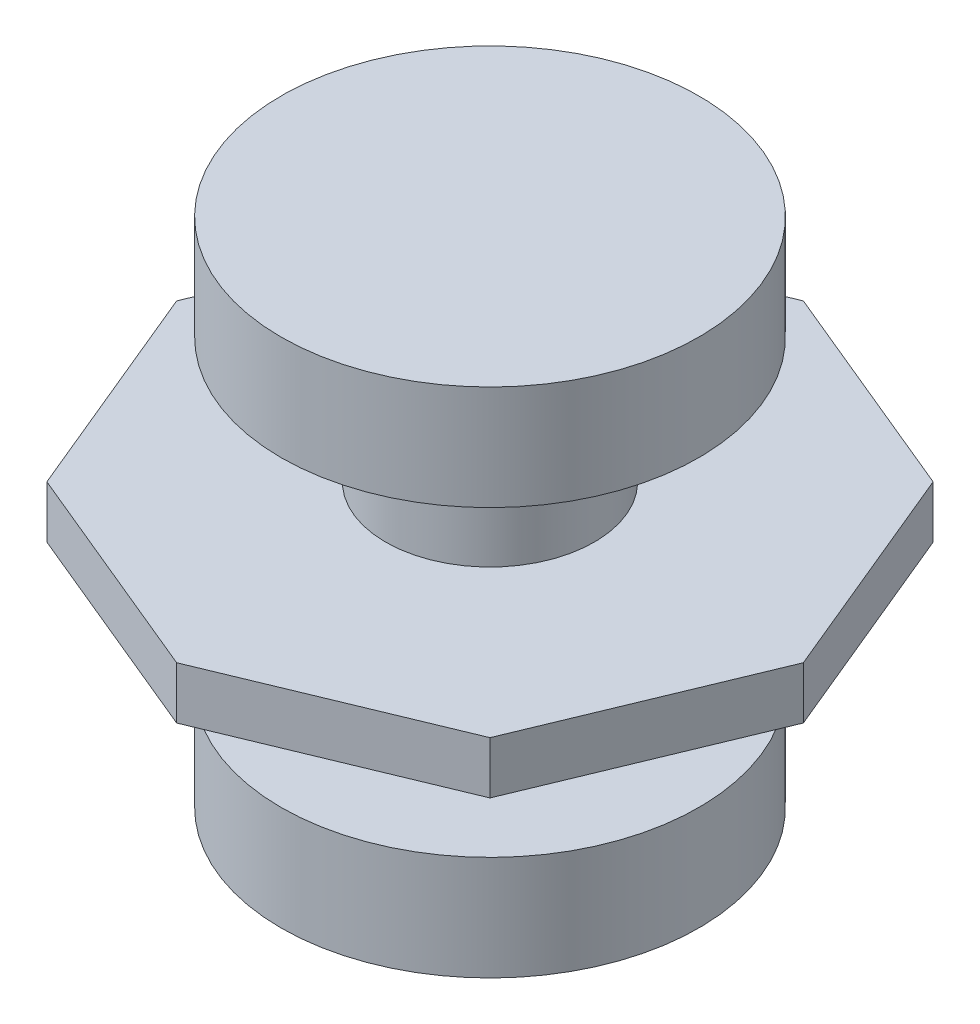
ISO-10303-21;
HEADER;
FILE_DESCRIPTION(('STEP AP214'),'2;1');
FILE_NAME('part.step','',(''),(''),'','','');
FILE_SCHEMA(('AUTOMOTIVE_DESIGN { 1 0 10303 214 1 1 1 1 }'));
ENDSEC;
DATA;
#1=APPLICATION_CONTEXT('core data for automotive mechanical design processes');
#2=APPLICATION_PROTOCOL_DEFINITION('international standard','automotive_design',2000,#1);
#3=PRODUCT_CONTEXT('',#1,'mechanical');
#4=PRODUCT('Part','Part','',(#3));
#5=PRODUCT_RELATED_PRODUCT_CATEGORY('part','',(#4));
#6=PRODUCT_DEFINITION_FORMATION('','',#4);
#7=PRODUCT_DEFINITION_CONTEXT('part definition',#1,'design');
#8=PRODUCT_DEFINITION('design','',#6,#7);
#9=PRODUCT_DEFINITION_SHAPE('','',#8);
#10=(LENGTH_UNIT() NAMED_UNIT(*) SI_UNIT(.MILLI.,.METRE.));
#11=(NAMED_UNIT(*) PLANE_ANGLE_UNIT() SI_UNIT($,.RADIAN.));
#12=(NAMED_UNIT(*) SI_UNIT($,.STERADIAN.) SOLID_ANGLE_UNIT());
#13=UNCERTAINTY_MEASURE_WITH_UNIT(LENGTH_MEASURE(1.E-05),#10,'distance_accuracy_value','');
#14=(GEOMETRIC_REPRESENTATION_CONTEXT(3) GLOBAL_UNCERTAINTY_ASSIGNED_CONTEXT((#13)) GLOBAL_UNIT_ASSIGNED_CONTEXT((#10,
#11,#12)) REPRESENTATION_CONTEXT('',''));
#15=CARTESIAN_POINT('',(0.,0.,0.));
#16=DIRECTION('',(0.,0.,1.));
#17=DIRECTION('',(1.,0.,0.));
#18=AXIS2_PLACEMENT_3D('',#15,#16,#17);
#19=CARTESIAN_POINT('',(0.,10.,0.));
#20=DIRECTION('',(0.,-1.,0.));
#21=DIRECTION('',(0.,0.,-1.));
#22=AXIS2_PLACEMENT_3D('',#19,#20,#21);
#23=CYLINDRICAL_SURFACE('',#22,20.);
#24=CARTESIAN_POINT('',(0.,10.,0.));
#25=DIRECTION('',(0.,1.,0.));
#26=DIRECTION('',(0.,0.,1.));
#27=AXIS2_PLACEMENT_3D('',#24,#25,#26);
#28=CIRCLE('',#27,20.);
#29=CARTESIAN_POINT('',(0.,10.,20.));
#30=VERTEX_POINT('',#29);
#31=EDGE_CURVE('E11',#30,#30,#28,.T.);
#32=ORIENTED_EDGE('',*,*,#31,.F.);
#33=EDGE_LOOP('',(#32));
#34=FACE_BOUND('',#33,.T.);
#35=CARTESIAN_POINT('',(0.,0.,0.));
#36=DIRECTION('',(0.,1.,0.));
#37=DIRECTION('',(0.,0.,1.));
#38=AXIS2_PLACEMENT_3D('',#35,#36,#37);
#39=CIRCLE('',#38,20.);
#40=CARTESIAN_POINT('',(0.,0.,20.));
#41=VERTEX_POINT('',#40);
#42=EDGE_CURVE('E36',#41,#41,#39,.T.);
#43=ORIENTED_EDGE('',*,*,#42,.T.);
#44=EDGE_LOOP('',(#43));
#45=FACE_BOUND('',#44,.T.);
#46=ADVANCED_FACE('F33',(#34,#45),#23,.T.);
#47=CARTESIAN_POINT('',(0.,10.,0.));
#48=DIRECTION('',(0.,1.,0.));
#49=DIRECTION('',(0.,0.,1.));
#50=AXIS2_PLACEMENT_3D('',#47,#48,#49);
#51=PLANE('',#50);
#52=CARTESIAN_POINT('',(0.,10.,0.));
#53=DIRECTION('',(0.,1.,0.));
#54=DIRECTION('',(0.,0.,1.));
#55=AXIS2_PLACEMENT_3D('',#52,#53,#54);
#56=CIRCLE('',#55,10.);
#57=CARTESIAN_POINT('',(0.,10.,10.));
#58=VERTEX_POINT('',#57);
#59=EDGE_CURVE('E160',#58,#58,#56,.T.);
#60=ORIENTED_EDGE('',*,*,#59,.F.);
#61=EDGE_LOOP('',(#60));
#62=FACE_BOUND('',#61,.T.);
#63=ORIENTED_EDGE('',*,*,#31,.T.);
#64=EDGE_LOOP('',(#63));
#65=FACE_BOUND('',#64,.T.);
#66=ADVANCED_FACE('F169',(#62,#65),#51,.T.);
#67=CARTESIAN_POINT('',(0.,0.,0.));
#68=DIRECTION('',(0.,1.,0.));
#69=DIRECTION('',(0.,0.,1.));
#70=AXIS2_PLACEMENT_3D('',#67,#68,#69);
#71=PLANE('',#70);
#72=ORIENTED_EDGE('',*,*,#42,.F.);
#73=EDGE_LOOP('',(#72));
#74=FACE_BOUND('',#73,.T.);
#75=ADVANCED_FACE('F172',(#74),#71,.F.);
#76=CARTESIAN_POINT('',(0.,22.,0.));
#77=DIRECTION('',(0.,-1.,0.));
#78=DIRECTION('',(0.,0.,-1.));
#79=AXIS2_PLACEMENT_3D('',#76,#77,#78);
#80=CYLINDRICAL_SURFACE('',#79,10.);
#81=CARTESIAN_POINT('',(0.,22.,0.));
#82=DIRECTION('',(0.,1.,0.));
#83=DIRECTION('',(0.,0.,1.));
#84=AXIS2_PLACEMENT_3D('',#81,#82,#83);
#85=CIRCLE('',#84,10.);
#86=CARTESIAN_POINT('',(0.,22.,10.));
#87=VERTEX_POINT('',#86);
#88=EDGE_CURVE('E161',#87,#87,#85,.T.);
#89=ORIENTED_EDGE('',*,*,#88,.F.);
#90=EDGE_LOOP('',(#89));
#91=FACE_BOUND('',#90,.T.);
#92=ORIENTED_EDGE('',*,*,#59,.T.);
#93=EDGE_LOOP('',(#92));
#94=FACE_BOUND('',#93,.T.);
#95=ADVANCED_FACE('F167',(#91,#94),#80,.T.);
#96=CARTESIAN_POINT('',(21.2132034355967,27.,21.2132034355962));
#97=DIRECTION('',(-0.923879532511291,0.,-0.382683432365079));
#98=DIRECTION('',(-0.382683432365079,0.,0.923879532511291));
#99=AXIS2_PLACEMENT_3D('',#96,#97,#98);
#100=PLANE('',#99);
#101=DIRECTION('',(0.382683432365079,0.,-0.923879532511291));
#102=VECTOR('',#101,1.);
#103=CARTESIAN_POINT('',(21.2132034355967,22.,21.2132034355962));
#104=LINE('',#103,#102);
#105=CARTESIAN_POINT('',(21.2132034355967,22.,21.2132034355962));
#106=VERTEX_POINT('',#105);
#107=CARTESIAN_POINT('',(30.,22.,-3.58999315140887E-13));
#108=VERTEX_POINT('',#107);
#109=EDGE_CURVE('E130',#106,#108,#104,.T.);
#110=ORIENTED_EDGE('',*,*,#109,.T.);
#111=DIRECTION('',(0.,-1.,0.));
#112=VECTOR('',#111,1.);
#113=CARTESIAN_POINT('',(30.,27.,-3.58999315140887E-13));
#114=LINE('',#113,#112);
#115=CARTESIAN_POINT('',(30.,27.,-3.58999315140887E-13));
#116=VERTEX_POINT('',#115);
#117=EDGE_CURVE('E158',#116,#108,#114,.T.);
#118=ORIENTED_EDGE('',*,*,#117,.F.);
#119=DIRECTION('',(0.382683432365079,0.,-0.923879532511291));
#120=VECTOR('',#119,1.);
#121=CARTESIAN_POINT('',(21.2132034355967,27.,21.2132034355962));
#122=LINE('',#121,#120);
#123=CARTESIAN_POINT('',(21.2132034355967,27.,21.2132034355962));
#124=VERTEX_POINT('',#123);
#125=EDGE_CURVE('E145',#124,#116,#122,.T.);
#126=ORIENTED_EDGE('',*,*,#125,.F.);
#127=DIRECTION('',(0.,-1.,0.));
#128=VECTOR('',#127,1.);
#129=CARTESIAN_POINT('',(21.2132034355967,27.,21.2132034355962));
#130=LINE('',#129,#128);
#131=EDGE_CURVE('E126',#124,#106,#130,.T.);
#132=ORIENTED_EDGE('',*,*,#131,.T.);
#133=EDGE_LOOP('',(#110,#118,#126,#132));
#134=FACE_BOUND('',#133,.T.);
#135=ADVANCED_FACE('F185',(#134),#100,.F.);
#136=CARTESIAN_POINT('',(30.,27.,-3.58999315140887E-13));
#137=DIRECTION('',(-0.923879532511282,0.,0.382683432365101));
#138=DIRECTION('',(0.382683432365101,0.,0.923879532511282));
#139=AXIS2_PLACEMENT_3D('',#136,#137,#138);
#140=PLANE('',#139);
#141=DIRECTION('',(-0.382683432365101,0.,-0.923879532511282));
#142=VECTOR('',#141,1.);
#143=CARTESIAN_POINT('',(30.,22.,-3.58999315140887E-13));
#144=LINE('',#143,#142);
#145=CARTESIAN_POINT('',(21.2132034355962,22.,-21.2132034355967));
#146=VERTEX_POINT('',#145);
#147=EDGE_CURVE('E133',#108,#146,#144,.T.);
#148=ORIENTED_EDGE('',*,*,#147,.T.);
#149=DIRECTION('',(0.,-1.,0.));
#150=VECTOR('',#149,1.);
#151=CARTESIAN_POINT('',(21.2132034355962,27.,-21.2132034355967));
#152=LINE('',#151,#150);
#153=CARTESIAN_POINT('',(21.2132034355962,27.,-21.2132034355967));
#154=VERTEX_POINT('',#153);
#155=EDGE_CURVE('E155',#154,#146,#152,.T.);
#156=ORIENTED_EDGE('',*,*,#155,.F.);
#157=DIRECTION('',(-0.382683432365101,0.,-0.923879532511282));
#158=VECTOR('',#157,1.);
#159=CARTESIAN_POINT('',(30.,27.,-3.58999315140887E-13));
#160=LINE('',#159,#158);
#161=EDGE_CURVE('E93',#116,#154,#160,.T.);
#162=ORIENTED_EDGE('',*,*,#161,.F.);
#163=ORIENTED_EDGE('',*,*,#117,.T.);
#164=EDGE_LOOP('',(#148,#156,#162,#163));
#165=FACE_BOUND('',#164,.T.);
#166=ADVANCED_FACE('F191',(#165),#140,.F.);
#167=CARTESIAN_POINT('',(21.2132034355962,27.,-21.2132034355967));
#168=DIRECTION('',(-0.382683432365079,0.,0.923879532511292));
#169=DIRECTION('',(0.923879532511292,0.,0.382683432365079));
#170=AXIS2_PLACEMENT_3D('',#167,#168,#169);
#171=PLANE('',#170);
#172=DIRECTION('',(-0.923879532511291,0.,-0.382683432365079));
#173=VECTOR('',#172,1.);
#174=CARTESIAN_POINT('',(21.2132034355962,22.,-21.2132034355967));
#175=LINE('',#174,#173);
#176=CARTESIAN_POINT('',(-3.57090914697493E-13,22.,-30.));
#177=VERTEX_POINT('',#176);
#178=EDGE_CURVE('E136',#146,#177,#175,.T.);
#179=ORIENTED_EDGE('',*,*,#178,.T.);
#180=DIRECTION('',(0.,-1.,0.));
#181=VECTOR('',#180,1.);
#182=CARTESIAN_POINT('',(-3.57090914697493E-13,27.,-30.));
#183=LINE('',#182,#181);
#184=CARTESIAN_POINT('',(-3.57090914697493E-13,27.,-30.));
#185=VERTEX_POINT('',#184);
#186=EDGE_CURVE('E152',#185,#177,#183,.T.);
#187=ORIENTED_EDGE('',*,*,#186,.F.);
#188=DIRECTION('',(-0.923879532511291,0.,-0.382683432365079));
#189=VECTOR('',#188,1.);
#190=CARTESIAN_POINT('',(21.2132034355962,27.,-21.2132034355967));
#191=LINE('',#190,#189);
#192=EDGE_CURVE('E253',#154,#185,#191,.T.);
#193=ORIENTED_EDGE('',*,*,#192,.F.);
#194=ORIENTED_EDGE('',*,*,#155,.T.);
#195=EDGE_LOOP('',(#179,#187,#193,#194));
#196=FACE_BOUND('',#195,.T.);
#197=ADVANCED_FACE('F195',(#196),#171,.F.);
#198=CARTESIAN_POINT('',(-3.57090914697493E-13,27.,-30.));
#199=DIRECTION('',(0.3826834323651,0.,0.923879532511282));
#200=DIRECTION('',(0.923879532511282,0.,-0.3826834323651));
#201=AXIS2_PLACEMENT_3D('',#198,#199,#200);
#202=PLANE('',#201);
#203=DIRECTION('',(-0.923879532511282,0.,0.3826834323651));
#204=VECTOR('',#203,1.);
#205=CARTESIAN_POINT('',(-3.57090914697493E-13,22.,-30.));
#206=LINE('',#205,#204);
#207=CARTESIAN_POINT('',(-21.2132034355967,22.,-21.2132034355962));
#208=VERTEX_POINT('',#207);
#209=EDGE_CURVE('E138',#177,#208,#206,.T.);
#210=ORIENTED_EDGE('',*,*,#209,.T.);
#211=DIRECTION('',(0.,-1.,0.));
#212=VECTOR('',#211,1.);
#213=CARTESIAN_POINT('',(-21.2132034355967,27.,-21.2132034355962));
#214=LINE('',#213,#212);
#215=CARTESIAN_POINT('',(-21.2132034355967,27.,-21.2132034355962));
#216=VERTEX_POINT('',#215);
#217=EDGE_CURVE('E149',#216,#208,#214,.T.);
#218=ORIENTED_EDGE('',*,*,#217,.F.);
#219=DIRECTION('',(-0.923879532511282,0.,0.3826834323651));
#220=VECTOR('',#219,1.);
#221=CARTESIAN_POINT('',(-3.57090914697493E-13,27.,-30.));
#222=LINE('',#221,#220);
#223=EDGE_CURVE('E255',#185,#216,#222,.T.);
#224=ORIENTED_EDGE('',*,*,#223,.F.);
#225=ORIENTED_EDGE('',*,*,#186,.T.);
#226=EDGE_LOOP('',(#210,#218,#224,#225));
#227=FACE_BOUND('',#226,.T.);
#228=ADVANCED_FACE('F198',(#227),#202,.F.);
#229=CARTESIAN_POINT('',(-21.2132034355967,27.,-21.2132034355962));
#230=DIRECTION('',(0.923879532511291,0.,0.382683432365079));
#231=DIRECTION('',(0.382683432365079,0.,-0.923879532511291));
#232=AXIS2_PLACEMENT_3D('',#229,#230,#231);
#233=PLANE('',#232);
#234=DIRECTION('',(-0.382683432365079,0.,0.923879532511291));
#235=VECTOR('',#234,1.);
#236=CARTESIAN_POINT('',(-21.2132034355967,22.,-21.2132034355962));
#237=LINE('',#236,#235);
#238=CARTESIAN_POINT('',(-30.,22.,3.49022216410589E-13));
#239=VERTEX_POINT('',#238);
#240=EDGE_CURVE('E140',#208,#239,#237,.T.);
#241=ORIENTED_EDGE('',*,*,#240,.T.);
#242=DIRECTION('',(0.,-1.,0.));
#243=VECTOR('',#242,1.);
#244=CARTESIAN_POINT('',(-30.,27.,3.49022216410589E-13));
#245=LINE('',#244,#243);
#246=CARTESIAN_POINT('',(-30.,27.,3.49022216410589E-13));
#247=VERTEX_POINT('',#246);
#248=EDGE_CURVE('E121',#247,#239,#245,.T.);
#249=ORIENTED_EDGE('',*,*,#248,.F.);
#250=DIRECTION('',(-0.382683432365079,0.,0.923879532511291));
#251=VECTOR('',#250,1.);
#252=CARTESIAN_POINT('',(-21.2132034355967,27.,-21.2132034355962));
#253=LINE('',#252,#251);
#254=EDGE_CURVE('E112',#216,#247,#253,.T.);
#255=ORIENTED_EDGE('',*,*,#254,.F.);
#256=ORIENTED_EDGE('',*,*,#217,.T.);
#257=EDGE_LOOP('',(#241,#249,#255,#256));
#258=FACE_BOUND('',#257,.T.);
#259=ADVANCED_FACE('F202',(#258),#233,.F.);
#260=CARTESIAN_POINT('',(-30.,27.,3.49022216410589E-13));
#261=DIRECTION('',(0.923879532511282,0.,-0.382683432365101));
#262=DIRECTION('',(-0.382683432365101,0.,-0.923879532511282));
#263=AXIS2_PLACEMENT_3D('',#260,#261,#262);
#264=PLANE('',#263);
#265=DIRECTION('',(0.382683432365101,0.,0.923879532511282));
#266=VECTOR('',#265,1.);
#267=CARTESIAN_POINT('',(-30.,22.,3.49022216410589E-13));
#268=LINE('',#267,#266);
#269=CARTESIAN_POINT('',(-21.2132034355962,22.,21.2132034355967));
#270=VERTEX_POINT('',#269);
#271=EDGE_CURVE('E120',#239,#270,#268,.T.);
#272=ORIENTED_EDGE('',*,*,#271,.T.);
#273=DIRECTION('',(0.,-1.,0.));
#274=VECTOR('',#273,1.);
#275=CARTESIAN_POINT('',(-21.2132034355962,27.,21.2132034355967));
#276=LINE('',#275,#274);
#277=CARTESIAN_POINT('',(-21.2132034355962,27.,21.2132034355967));
#278=VERTEX_POINT('',#277);
#279=EDGE_CURVE('E117',#278,#270,#276,.T.);
#280=ORIENTED_EDGE('',*,*,#279,.F.);
#281=DIRECTION('',(0.382683432365101,0.,0.923879532511282));
#282=VECTOR('',#281,1.);
#283=CARTESIAN_POINT('',(-30.,27.,3.49022216410589E-13));
#284=LINE('',#283,#282);
#285=EDGE_CURVE('E106',#247,#278,#284,.T.);
#286=ORIENTED_EDGE('',*,*,#285,.F.);
#287=ORIENTED_EDGE('',*,*,#248,.T.);
#288=EDGE_LOOP('',(#272,#280,#286,#287));
#289=FACE_BOUND('',#288,.T.);
#290=ADVANCED_FACE('F118',(#289),#264,.F.);
#291=CARTESIAN_POINT('',(-21.2132034355962,27.,21.2132034355967));
#292=DIRECTION('',(0.382683432365079,0.,-0.923879532511291));
#293=DIRECTION('',(-0.923879532511291,0.,-0.382683432365079));
#294=AXIS2_PLACEMENT_3D('',#291,#292,#293);
#295=PLANE('',#294);
#296=DIRECTION('',(0.923879532511291,0.,0.382683432365079));
#297=VECTOR('',#296,1.);
#298=CARTESIAN_POINT('',(-21.2132034355962,22.,21.2132034355967));
#299=LINE('',#298,#297);
#300=CARTESIAN_POINT('',(3.60540284535054E-13,22.,30.));
#301=VERTEX_POINT('',#300);
#302=EDGE_CURVE('E78',#270,#301,#299,.T.);
#303=ORIENTED_EDGE('',*,*,#302,.T.);
#304=DIRECTION('',(0.,-1.,0.));
#305=VECTOR('',#304,1.);
#306=CARTESIAN_POINT('',(3.60540284535054E-13,27.,30.));
#307=LINE('',#306,#305);
#308=CARTESIAN_POINT('',(3.60540284535054E-13,27.,30.));
#309=VERTEX_POINT('',#308);
#310=EDGE_CURVE('E122',#309,#301,#307,.T.);
#311=ORIENTED_EDGE('',*,*,#310,.F.);
#312=DIRECTION('',(0.923879532511291,0.,0.382683432365079));
#313=VECTOR('',#312,1.);
#314=CARTESIAN_POINT('',(-21.2132034355962,27.,21.2132034355967));
#315=LINE('',#314,#313);
#316=EDGE_CURVE('E110',#278,#309,#315,.T.);
#317=ORIENTED_EDGE('',*,*,#316,.F.);
#318=ORIENTED_EDGE('',*,*,#279,.T.);
#319=EDGE_LOOP('',(#303,#311,#317,#318));
#320=FACE_BOUND('',#319,.T.);
#321=ADVANCED_FACE('F124',(#320),#295,.F.);
#322=CARTESIAN_POINT('',(3.60540284535054E-13,27.,30.));
#323=DIRECTION('',(-0.382683432365101,0.,-0.923879532511282));
#324=DIRECTION('',(-0.923879532511282,0.,0.382683432365101));
#325=AXIS2_PLACEMENT_3D('',#322,#323,#324);
#326=PLANE('',#325);
#327=DIRECTION('',(0.923879532511282,0.,-0.382683432365101));
#328=VECTOR('',#327,1.);
#329=CARTESIAN_POINT('',(3.60540284535054E-13,22.,30.));
#330=LINE('',#329,#328);
#331=EDGE_CURVE('E84',#301,#106,#330,.T.);
#332=ORIENTED_EDGE('',*,*,#331,.T.);
#333=ORIENTED_EDGE('',*,*,#131,.F.);
#334=DIRECTION('',(0.923879532511282,0.,-0.382683432365101));
#335=VECTOR('',#334,1.);
#336=CARTESIAN_POINT('',(3.60540284535054E-13,27.,30.));
#337=LINE('',#336,#335);
#338=EDGE_CURVE('E49',#309,#124,#337,.T.);
#339=ORIENTED_EDGE('',*,*,#338,.F.);
#340=ORIENTED_EDGE('',*,*,#310,.T.);
#341=EDGE_LOOP('',(#332,#333,#339,#340));
#342=FACE_BOUND('',#341,.T.);
#343=ADVANCED_FACE('F211',(#342),#326,.F.);
#344=CARTESIAN_POINT('',(0.,27.,0.));
#345=DIRECTION('',(0.,1.,0.));
#346=DIRECTION('',(0.,0.,1.));
#347=AXIS2_PLACEMENT_3D('',#344,#345,#346);
#348=PLANE('',#347);
#349=CARTESIAN_POINT('',(0.,27.,0.));
#350=DIRECTION('',(0.,1.,0.));
#351=DIRECTION('',(0.,0.,1.));
#352=AXIS2_PLACEMENT_3D('',#349,#350,#351);
#353=CIRCLE('',#352,10.);
#354=CARTESIAN_POINT('',(0.,27.,10.));
#355=VERTEX_POINT('',#354);
#356=EDGE_CURVE('E241',#355,#355,#353,.T.);
#357=ORIENTED_EDGE('',*,*,#356,.F.);
#358=EDGE_LOOP('',(#357));
#359=FACE_BOUND('',#358,.T.);
#360=ORIENTED_EDGE('',*,*,#125,.T.);
#361=ORIENTED_EDGE('',*,*,#161,.T.);
#362=ORIENTED_EDGE('',*,*,#192,.T.);
#363=ORIENTED_EDGE('',*,*,#223,.T.);
#364=ORIENTED_EDGE('',*,*,#254,.T.);
#365=ORIENTED_EDGE('',*,*,#285,.T.);
#366=ORIENTED_EDGE('',*,*,#316,.T.);
#367=ORIENTED_EDGE('',*,*,#338,.T.);
#368=EDGE_LOOP('',(#360,#361,#362,#363,#364,#365,#366,#367));
#369=FACE_BOUND('',#368,.T.);
#370=ADVANCED_FACE('F108',(#359,#369),#348,.T.);
#371=CARTESIAN_POINT('',(0.,22.,0.));
#372=DIRECTION('',(0.,1.,0.));
#373=DIRECTION('',(0.,0.,1.));
#374=AXIS2_PLACEMENT_3D('',#371,#372,#373);
#375=PLANE('',#374);
#376=ORIENTED_EDGE('',*,*,#88,.T.);
#377=EDGE_LOOP('',(#376));
#378=FACE_BOUND('',#377,.T.);
#379=ORIENTED_EDGE('',*,*,#109,.F.);
#380=ORIENTED_EDGE('',*,*,#331,.F.);
#381=ORIENTED_EDGE('',*,*,#302,.F.);
#382=ORIENTED_EDGE('',*,*,#271,.F.);
#383=ORIENTED_EDGE('',*,*,#240,.F.);
#384=ORIENTED_EDGE('',*,*,#209,.F.);
#385=ORIENTED_EDGE('',*,*,#178,.F.);
#386=ORIENTED_EDGE('',*,*,#147,.F.);
#387=EDGE_LOOP('',(#379,#380,#381,#382,#383,#384,#385,#386));
#388=FACE_BOUND('',#387,.T.);
#389=ADVANCED_FACE('F214',(#378,#388),#375,.F.);
#390=CARTESIAN_POINT('',(0.,39.,0.));
#391=DIRECTION('',(0.,-1.,0.));
#392=DIRECTION('',(0.,0.,-1.));
#393=AXIS2_PLACEMENT_3D('',#390,#391,#392);
#394=CYLINDRICAL_SURFACE('',#393,10.);
#395=CARTESIAN_POINT('',(0.,39.,0.));
#396=DIRECTION('',(0.,1.,0.));
#397=DIRECTION('',(0.,0.,1.));
#398=AXIS2_PLACEMENT_3D('',#395,#396,#397);
#399=CIRCLE('',#398,10.);
#400=CARTESIAN_POINT('',(0.,39.,10.));
#401=VERTEX_POINT('',#400);
#402=EDGE_CURVE('E134',#401,#401,#399,.T.);
#403=ORIENTED_EDGE('',*,*,#402,.F.);
#404=EDGE_LOOP('',(#403));
#405=FACE_BOUND('',#404,.T.);
#406=ORIENTED_EDGE('',*,*,#356,.T.);
#407=EDGE_LOOP('',(#406));
#408=FACE_BOUND('',#407,.T.);
#409=ADVANCED_FACE('F217',(#405,#408),#394,.T.);
#410=CARTESIAN_POINT('',(0.,49.,0.));
#411=DIRECTION('',(0.,-1.,0.));
#412=DIRECTION('',(0.,0.,-1.));
#413=AXIS2_PLACEMENT_3D('',#410,#411,#412);
#414=CYLINDRICAL_SURFACE('',#413,20.);
#415=CARTESIAN_POINT('',(0.,49.,0.));
#416=DIRECTION('',(0.,1.,0.));
#417=DIRECTION('',(0.,0.,1.));
#418=AXIS2_PLACEMENT_3D('',#415,#416,#417);
#419=CIRCLE('',#418,20.);
#420=CARTESIAN_POINT('',(0.,49.,20.));
#421=VERTEX_POINT('',#420);
#422=EDGE_CURVE('E240',#421,#421,#419,.T.);
#423=ORIENTED_EDGE('',*,*,#422,.F.);
#424=EDGE_LOOP('',(#423));
#425=FACE_BOUND('',#424,.T.);
#426=CARTESIAN_POINT('',(0.,39.,0.));
#427=DIRECTION('',(0.,1.,0.));
#428=DIRECTION('',(0.,0.,1.));
#429=AXIS2_PLACEMENT_3D('',#426,#427,#428);
#430=CIRCLE('',#429,20.);
#431=CARTESIAN_POINT('',(0.,39.,20.));
#432=VERTEX_POINT('',#431);
#433=EDGE_CURVE('E242',#432,#432,#430,.T.);
#434=ORIENTED_EDGE('',*,*,#433,.T.);
#435=EDGE_LOOP('',(#434));
#436=FACE_BOUND('',#435,.T.);
#437=ADVANCED_FACE('F224',(#425,#436),#414,.T.);
#438=CARTESIAN_POINT('',(0.,49.,0.));
#439=DIRECTION('',(0.,1.,0.));
#440=DIRECTION('',(0.,0.,1.));
#441=AXIS2_PLACEMENT_3D('',#438,#439,#440);
#442=PLANE('',#441);
#443=ORIENTED_EDGE('',*,*,#422,.T.);
#444=EDGE_LOOP('',(#443));
#445=FACE_BOUND('',#444,.T.);
#446=ADVANCED_FACE('F228',(#445),#442,.T.);
#447=CARTESIAN_POINT('',(0.,39.,0.));
#448=DIRECTION('',(0.,1.,0.));
#449=DIRECTION('',(0.,0.,1.));
#450=AXIS2_PLACEMENT_3D('',#447,#448,#449);
#451=PLANE('',#450);
#452=ORIENTED_EDGE('',*,*,#402,.T.);
#453=EDGE_LOOP('',(#452));
#454=FACE_BOUND('',#453,.T.);
#455=ORIENTED_EDGE('',*,*,#433,.F.);
#456=EDGE_LOOP('',(#455));
#457=FACE_BOUND('',#456,.T.);
#458=ADVANCED_FACE('F230',(#454,#457),#451,.F.);
#459=CLOSED_SHELL('',(#46,#66,#75,#95,#135,#166,#197,#228,#259,#290,#321,#343,#370,#389,#409,
#437,#446,#458));
#460=MANIFOLD_SOLID_BREP('B2',#459);
#461=ADVANCED_BREP_SHAPE_REPRESENTATION('',(#18,#460),#14);
#462=SHAPE_DEFINITION_REPRESENTATION(#9,#461);
ENDSEC;
END-ISO-10303-21;
